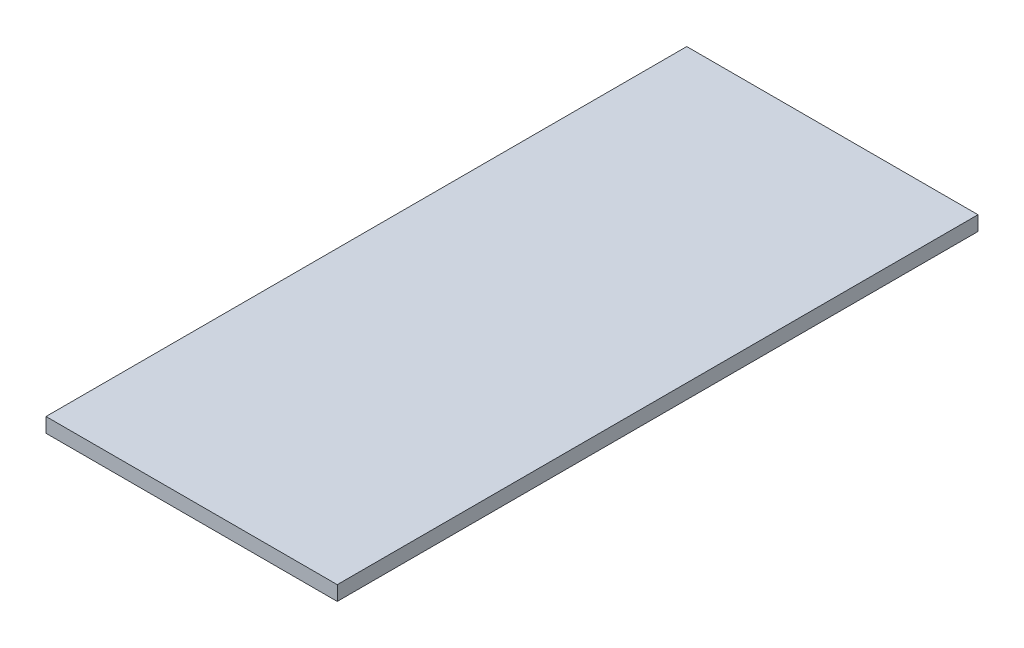
ISO-10303-21;
HEADER;
FILE_DESCRIPTION(('STEP AP214'),'2;1');
FILE_NAME('part.step','',(''),(''),'','','');
FILE_SCHEMA(('AUTOMOTIVE_DESIGN { 1 0 10303 214 1 1 1 1 }'));
ENDSEC;
DATA;
#1=APPLICATION_CONTEXT('core data for automotive mechanical design processes');
#2=APPLICATION_PROTOCOL_DEFINITION('international standard','automotive_design',2000,#1);
#3=PRODUCT_CONTEXT('',#1,'mechanical');
#4=PRODUCT('Part','Part','',(#3));
#5=PRODUCT_RELATED_PRODUCT_CATEGORY('part','',(#4));
#6=PRODUCT_DEFINITION_FORMATION('','',#4);
#7=PRODUCT_DEFINITION_CONTEXT('part definition',#1,'design');
#8=PRODUCT_DEFINITION('design','',#6,#7);
#9=PRODUCT_DEFINITION_SHAPE('','',#8);
#10=(LENGTH_UNIT() NAMED_UNIT(*) SI_UNIT(.MILLI.,.METRE.));
#11=(NAMED_UNIT(*) PLANE_ANGLE_UNIT() SI_UNIT($,.RADIAN.));
#12=(NAMED_UNIT(*) SI_UNIT($,.STERADIAN.) SOLID_ANGLE_UNIT());
#13=UNCERTAINTY_MEASURE_WITH_UNIT(LENGTH_MEASURE(1.E-05),#10,'distance_accuracy_value','');
#14=(GEOMETRIC_REPRESENTATION_CONTEXT(3) GLOBAL_UNCERTAINTY_ASSIGNED_CONTEXT((#13)) GLOBAL_UNIT_ASSIGNED_CONTEXT((#10,
#11,#12)) REPRESENTATION_CONTEXT('',''));
#15=CARTESIAN_POINT('',(0.,0.,0.));
#16=DIRECTION('',(0.,0.,1.));
#17=DIRECTION('',(1.,0.,0.));
#18=AXIS2_PLACEMENT_3D('',#15,#16,#17);
#19=CARTESIAN_POINT('',(127.,12.7,279.4));
#20=DIRECTION('',(-1.,0.,0.));
#21=DIRECTION('',(0.,0.,1.));
#22=AXIS2_PLACEMENT_3D('',#19,#20,#21);
#23=PLANE('',#22);
#24=DIRECTION('',(0.,0.,-1.));
#25=VECTOR('',#24,1.);
#26=CARTESIAN_POINT('',(127.,0.,279.4));
#27=LINE('',#26,#25);
#28=CARTESIAN_POINT('',(127.,0.,279.4));
#29=VERTEX_POINT('',#28);
#30=CARTESIAN_POINT('',(127.,0.,-279.4));
#31=VERTEX_POINT('',#30);
#32=EDGE_CURVE('E98',#29,#31,#27,.T.);
#33=ORIENTED_EDGE('',*,*,#32,.T.);
#34=DIRECTION('',(0.,-1.,0.));
#35=VECTOR('',#34,1.);
#36=CARTESIAN_POINT('',(127.,12.7,-279.4));
#37=LINE('',#36,#35);
#38=CARTESIAN_POINT('',(127.,12.7,-279.4));
#39=VERTEX_POINT('',#38);
#40=EDGE_CURVE('E11',#39,#31,#37,.T.);
#41=ORIENTED_EDGE('',*,*,#40,.F.);
#42=DIRECTION('',(0.,0.,-1.));
#43=VECTOR('',#42,1.);
#44=CARTESIAN_POINT('',(127.,12.7,279.4));
#45=LINE('',#44,#43);
#46=CARTESIAN_POINT('',(127.,12.7,279.4));
#47=VERTEX_POINT('',#46);
#48=EDGE_CURVE('E86',#47,#39,#45,.T.);
#49=ORIENTED_EDGE('',*,*,#48,.F.);
#50=DIRECTION('',(0.,-1.,0.));
#51=VECTOR('',#50,1.);
#52=CARTESIAN_POINT('',(127.,12.7,279.4));
#53=LINE('',#52,#51);
#54=EDGE_CURVE('E94',#47,#29,#53,.T.);
#55=ORIENTED_EDGE('',*,*,#54,.T.);
#56=EDGE_LOOP('',(#33,#41,#49,#55));
#57=FACE_BOUND('',#56,.T.);
#58=ADVANCED_FACE('F35',(#57),#23,.F.);
#59=CARTESIAN_POINT('',(-127.,12.7,-279.4));
#60=DIRECTION('',(0.,0.,1.));
#61=DIRECTION('',(1.,0.,0.));
#62=AXIS2_PLACEMENT_3D('',#59,#60,#61);
#63=PLANE('',#62);
#64=DIRECTION('',(-1.,0.,0.));
#65=VECTOR('',#64,1.);
#66=CARTESIAN_POINT('',(-127.,0.,-279.4));
#67=LINE('',#66,#65);
#68=CARTESIAN_POINT('',(-127.,0.,-279.4));
#69=VERTEX_POINT('',#68);
#70=EDGE_CURVE('E90',#31,#69,#67,.T.);
#71=ORIENTED_EDGE('',*,*,#70,.T.);
#72=DIRECTION('',(0.,-1.,0.));
#73=VECTOR('',#72,1.);
#74=CARTESIAN_POINT('',(-127.,12.7,-279.4));
#75=LINE('',#74,#73);
#76=CARTESIAN_POINT('',(-127.,12.7,-279.4));
#77=VERTEX_POINT('',#76);
#78=EDGE_CURVE('E43',#77,#69,#75,.T.);
#79=ORIENTED_EDGE('',*,*,#78,.F.);
#80=DIRECTION('',(-1.,0.,0.));
#81=VECTOR('',#80,1.);
#82=CARTESIAN_POINT('',(-127.,12.7,-279.4));
#83=LINE('',#82,#81);
#84=EDGE_CURVE('E81',#39,#77,#83,.T.);
#85=ORIENTED_EDGE('',*,*,#84,.F.);
#86=ORIENTED_EDGE('',*,*,#40,.T.);
#87=EDGE_LOOP('',(#71,#79,#85,#86));
#88=FACE_BOUND('',#87,.T.);
#89=ADVANCED_FACE('F89',(#88),#63,.F.);
#90=CARTESIAN_POINT('',(-127.,12.7,279.4));
#91=DIRECTION('',(1.,0.,0.));
#92=DIRECTION('',(0.,0.,-1.));
#93=AXIS2_PLACEMENT_3D('',#90,#91,#92);
#94=PLANE('',#93);
#95=DIRECTION('',(0.,0.,1.));
#96=VECTOR('',#95,1.);
#97=CARTESIAN_POINT('',(-127.,0.,279.4));
#98=LINE('',#97,#96);
#99=CARTESIAN_POINT('',(-127.,0.,279.4));
#100=VERTEX_POINT('',#99);
#101=EDGE_CURVE('E68',#69,#100,#98,.T.);
#102=ORIENTED_EDGE('',*,*,#101,.T.);
#103=DIRECTION('',(0.,-1.,0.));
#104=VECTOR('',#103,1.);
#105=CARTESIAN_POINT('',(-127.,12.7,279.4));
#106=LINE('',#105,#104);
#107=CARTESIAN_POINT('',(-127.,12.7,279.4));
#108=VERTEX_POINT('',#107);
#109=EDGE_CURVE('E91',#108,#100,#106,.T.);
#110=ORIENTED_EDGE('',*,*,#109,.F.);
#111=DIRECTION('',(0.,0.,1.));
#112=VECTOR('',#111,1.);
#113=CARTESIAN_POINT('',(-127.,12.7,279.4));
#114=LINE('',#113,#112);
#115=EDGE_CURVE('E84',#77,#108,#114,.T.);
#116=ORIENTED_EDGE('',*,*,#115,.F.);
#117=ORIENTED_EDGE('',*,*,#78,.T.);
#118=EDGE_LOOP('',(#102,#110,#116,#117));
#119=FACE_BOUND('',#118,.T.);
#120=ADVANCED_FACE('F92',(#119),#94,.F.);
#121=CARTESIAN_POINT('',(-127.,12.7,279.4));
#122=DIRECTION('',(0.,0.,-1.));
#123=DIRECTION('',(-1.,0.,0.));
#124=AXIS2_PLACEMENT_3D('',#121,#122,#123);
#125=PLANE('',#124);
#126=DIRECTION('',(1.,0.,0.));
#127=VECTOR('',#126,1.);
#128=CARTESIAN_POINT('',(-127.,0.,279.4));
#129=LINE('',#128,#127);
#130=EDGE_CURVE('E74',#100,#29,#129,.T.);
#131=ORIENTED_EDGE('',*,*,#130,.T.);
#132=ORIENTED_EDGE('',*,*,#54,.F.);
#133=DIRECTION('',(1.,0.,0.));
#134=VECTOR('',#133,1.);
#135=CARTESIAN_POINT('',(-127.,12.7,279.4));
#136=LINE('',#135,#134);
#137=EDGE_CURVE('E51',#108,#47,#136,.T.);
#138=ORIENTED_EDGE('',*,*,#137,.F.);
#139=ORIENTED_EDGE('',*,*,#109,.T.);
#140=EDGE_LOOP('',(#131,#132,#138,#139));
#141=FACE_BOUND('',#140,.T.);
#142=ADVANCED_FACE('F105',(#141),#125,.F.);
#143=CARTESIAN_POINT('',(0.,12.7,0.));
#144=DIRECTION('',(0.,-1.,0.));
#145=DIRECTION('',(0.,0.,-1.));
#146=AXIS2_PLACEMENT_3D('',#143,#144,#145);
#147=PLANE('',#146);
#148=ORIENTED_EDGE('',*,*,#48,.T.);
#149=ORIENTED_EDGE('',*,*,#84,.T.);
#150=ORIENTED_EDGE('',*,*,#115,.T.);
#151=ORIENTED_EDGE('',*,*,#137,.T.);
#152=EDGE_LOOP('',(#148,#149,#150,#151));
#153=FACE_BOUND('',#152,.T.);
#154=ADVANCED_FACE('F82',(#153),#147,.F.);
#155=CARTESIAN_POINT('',(0.,0.,0.));
#156=DIRECTION('',(0.,-1.,0.));
#157=DIRECTION('',(0.,0.,-1.));
#158=AXIS2_PLACEMENT_3D('',#155,#156,#157);
#159=PLANE('',#158);
#160=ORIENTED_EDGE('',*,*,#32,.F.);
#161=ORIENTED_EDGE('',*,*,#130,.F.);
#162=ORIENTED_EDGE('',*,*,#101,.F.);
#163=ORIENTED_EDGE('',*,*,#70,.F.);
#164=EDGE_LOOP('',(#160,#161,#162,#163));
#165=FACE_BOUND('',#164,.T.);
#166=ADVANCED_FACE('F108',(#165),#159,.T.);
#167=CLOSED_SHELL('',(#58,#89,#120,#142,#154,#166));
#168=MANIFOLD_SOLID_BREP('B2',#167);
#169=ADVANCED_BREP_SHAPE_REPRESENTATION('',(#18,#168),#14);
#170=SHAPE_DEFINITION_REPRESENTATION(#9,#169);
ENDSEC;
END-ISO-10303-21;
